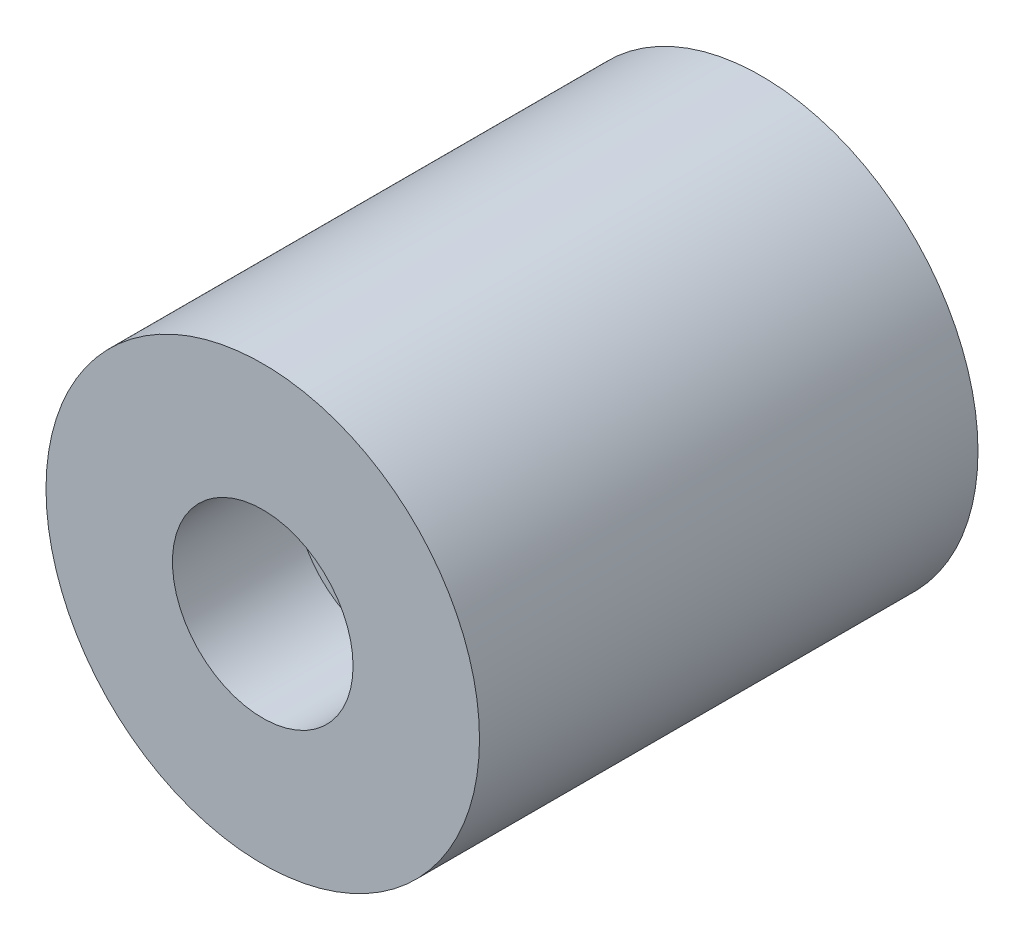
ISO-10303-21;
HEADER;
FILE_DESCRIPTION(('STEP AP214'),'2;1');
FILE_NAME('part.step','',(''),(''),'','','');
FILE_SCHEMA(('AUTOMOTIVE_DESIGN { 1 0 10303 214 1 1 1 1 }'));
ENDSEC;
DATA;
#1=APPLICATION_CONTEXT('core data for automotive mechanical design processes');
#2=APPLICATION_PROTOCOL_DEFINITION('international standard','automotive_design',2000,#1);
#3=PRODUCT_CONTEXT('',#1,'mechanical');
#4=PRODUCT('Part','Part','',(#3));
#5=PRODUCT_RELATED_PRODUCT_CATEGORY('part','',(#4));
#6=PRODUCT_DEFINITION_FORMATION('','',#4);
#7=PRODUCT_DEFINITION_CONTEXT('part definition',#1,'design');
#8=PRODUCT_DEFINITION('design','',#6,#7);
#9=PRODUCT_DEFINITION_SHAPE('','',#8);
#10=(LENGTH_UNIT() NAMED_UNIT(*) SI_UNIT(.MILLI.,.METRE.));
#11=(NAMED_UNIT(*) PLANE_ANGLE_UNIT() SI_UNIT($,.RADIAN.));
#12=(NAMED_UNIT(*) SI_UNIT($,.STERADIAN.) SOLID_ANGLE_UNIT());
#13=UNCERTAINTY_MEASURE_WITH_UNIT(LENGTH_MEASURE(1.E-05),#10,'distance_accuracy_value','');
#14=(GEOMETRIC_REPRESENTATION_CONTEXT(3) GLOBAL_UNCERTAINTY_ASSIGNED_CONTEXT((#13)) GLOBAL_UNIT_ASSIGNED_CONTEXT((#10,
#11,#12)) REPRESENTATION_CONTEXT('',''));
#15=CARTESIAN_POINT('',(0.,0.,0.));
#16=DIRECTION('',(0.,0.,1.));
#17=DIRECTION('',(1.,0.,0.));
#18=AXIS2_PLACEMENT_3D('',#15,#16,#17);
#19=CARTESIAN_POINT('',(0.,0.,-46.0859527144635));
#20=DIRECTION('',(0.,0.,1.));
#21=DIRECTION('',(1.,0.,0.));
#22=AXIS2_PLACEMENT_3D('',#19,#20,#21);
#23=CYLINDRICAL_SURFACE('',#22,3.25);
#24=CARTESIAN_POINT('',(0.,0.,-46.0859527144635));
#25=DIRECTION('',(0.,0.,1.));
#26=DIRECTION('',(1.,0.,0.));
#27=AXIS2_PLACEMENT_3D('',#24,#25,#26);
#28=CIRCLE('',#27,3.25);
#29=CARTESIAN_POINT('',(3.25,0.,-46.0859527144635));
#30=VERTEX_POINT('',#29);
#31=EDGE_CURVE('E50',#30,#30,#28,.T.);
#32=ORIENTED_EDGE('',*,*,#31,.F.);
#33=EDGE_LOOP('',(#32));
#34=FACE_BOUND('',#33,.T.);
#35=CARTESIAN_POINT('',(0.,0.,-36.09));
#36=DIRECTION('',(0.,0.,1.));
#37=DIRECTION('',(1.,0.,0.));
#38=AXIS2_PLACEMENT_3D('',#35,#36,#37);
#39=CIRCLE('',#38,3.25);
#40=CARTESIAN_POINT('',(3.25,0.,-36.09));
#41=VERTEX_POINT('',#40);
#42=EDGE_CURVE('E60',#41,#41,#39,.T.);
#43=ORIENTED_EDGE('',*,*,#42,.T.);
#44=EDGE_LOOP('',(#43));
#45=FACE_BOUND('',#44,.T.);
#46=ADVANCED_FACE('F31',(#34,#45),#23,.F.);
#47=CARTESIAN_POINT('',(0.,0.,-40.09));
#48=DIRECTION('',(0.,0.,1.));
#49=DIRECTION('',(1.,0.,0.));
#50=AXIS2_PLACEMENT_3D('',#47,#48,#49);
#51=CYLINDRICAL_SURFACE('',#50,30.);
#52=CARTESIAN_POINT('',(0.,0.,27.91));
#53=DIRECTION('',(0.,0.,1.));
#54=DIRECTION('',(1.,0.,0.));
#55=AXIS2_PLACEMENT_3D('',#52,#53,#54);
#56=CIRCLE('',#55,30.);
#57=CARTESIAN_POINT('',(30.,0.,27.91));
#58=VERTEX_POINT('',#57);
#59=EDGE_CURVE('E10',#58,#58,#56,.T.);
#60=ORIENTED_EDGE('',*,*,#59,.F.);
#61=EDGE_LOOP('',(#60));
#62=FACE_BOUND('',#61,.T.);
#63=CARTESIAN_POINT('',(0.,0.,-41.0859527144635));
#64=DIRECTION('',(0.,0.,-1.));
#65=DIRECTION('',(-1.,0.,0.));
#66=AXIS2_PLACEMENT_3D('',#63,#64,#65);
#67=CIRCLE('',#66,30.);
#68=CARTESIAN_POINT('',(-30.,0.,-41.0859527144635));
#69=VERTEX_POINT('',#68);
#70=EDGE_CURVE('E54',#69,#69,#67,.T.);
#71=ORIENTED_EDGE('',*,*,#70,.F.);
#72=EDGE_LOOP('',(#71));
#73=FACE_BOUND('',#72,.T.);
#74=ADVANCED_FACE('F33',(#62,#73),#51,.T.);
#75=CARTESIAN_POINT('',(0.,0.,-40.09));
#76=DIRECTION('',(0.,0.,1.));
#77=DIRECTION('',(1.,0.,0.));
#78=AXIS2_PLACEMENT_3D('',#75,#76,#77);
#79=CYLINDRICAL_SURFACE('',#78,9.25);
#80=CARTESIAN_POINT('',(0.,0.,-36.09));
#81=DIRECTION('',(0.,0.,1.));
#82=DIRECTION('',(1.,0.,0.));
#83=AXIS2_PLACEMENT_3D('',#80,#81,#82);
#84=CIRCLE('',#83,9.25);
#85=CARTESIAN_POINT('',(9.25,0.,-36.09));
#86=VERTEX_POINT('',#85);
#87=EDGE_CURVE('E57',#86,#86,#84,.T.);
#88=ORIENTED_EDGE('',*,*,#87,.F.);
#89=EDGE_LOOP('',(#88));
#90=FACE_BOUND('',#89,.T.);
#91=CARTESIAN_POINT('',(0.,0.,10.91));
#92=DIRECTION('',(0.,0.,1.));
#93=DIRECTION('',(1.,0.,0.));
#94=AXIS2_PLACEMENT_3D('',#91,#92,#93);
#95=CIRCLE('',#94,9.25);
#96=CARTESIAN_POINT('',(9.25,0.,10.91));
#97=VERTEX_POINT('',#96);
#98=EDGE_CURVE('E66',#97,#97,#95,.T.);
#99=ORIENTED_EDGE('',*,*,#98,.T.);
#100=EDGE_LOOP('',(#99));
#101=FACE_BOUND('',#100,.T.);
#102=ADVANCED_FACE('F70',(#90,#101),#79,.F.);
#103=CARTESIAN_POINT('',(0.,0.,27.91));
#104=DIRECTION('',(0.,0.,1.));
#105=DIRECTION('',(1.,0.,0.));
#106=AXIS2_PLACEMENT_3D('',#103,#104,#105);
#107=PLANE('',#106);
#108=CARTESIAN_POINT('',(0.,5.38517799615772E-13,27.91));
#109=DIRECTION('',(0.,0.,1.));
#110=DIRECTION('',(1.,0.,0.));
#111=AXIS2_PLACEMENT_3D('',#108,#109,#110);
#112=CIRCLE('',#111,12.5);
#113=CARTESIAN_POINT('',(12.5,5.38517799615772E-13,27.91));
#114=VERTEX_POINT('',#113);
#115=EDGE_CURVE('E38',#114,#114,#112,.T.);
#116=ORIENTED_EDGE('',*,*,#115,.F.);
#117=EDGE_LOOP('',(#116));
#118=FACE_BOUND('',#117,.T.);
#119=ORIENTED_EDGE('',*,*,#59,.T.);
#120=EDGE_LOOP('',(#119));
#121=FACE_BOUND('',#120,.T.);
#122=ADVANCED_FACE('F108',(#118,#121),#107,.T.);
#123=CARTESIAN_POINT('',(0.,5.38517799615772E-13,8.91));
#124=DIRECTION('',(0.,0.,1.));
#125=DIRECTION('',(1.,0.,0.));
#126=AXIS2_PLACEMENT_3D('',#123,#124,#125);
#127=CYLINDRICAL_SURFACE('',#126,12.5);
#128=CARTESIAN_POINT('',(0.,0.,10.91));
#129=DIRECTION('',(0.,0.,1.));
#130=DIRECTION('',(1.,0.,0.));
#131=AXIS2_PLACEMENT_3D('',#128,#129,#130);
#132=CIRCLE('',#131,12.5000000000002);
#133=CARTESIAN_POINT('',(12.5000000000002,0.,10.91));
#134=VERTEX_POINT('',#133);
#135=EDGE_CURVE('E63',#134,#134,#132,.T.);
#136=ORIENTED_EDGE('',*,*,#135,.F.);
#137=EDGE_LOOP('',(#136));
#138=FACE_BOUND('',#137,.T.);
#139=ORIENTED_EDGE('',*,*,#115,.T.);
#140=EDGE_LOOP('',(#139));
#141=FACE_BOUND('',#140,.T.);
#142=ADVANCED_FACE('F101',(#138,#141),#127,.F.);
#143=CARTESIAN_POINT('',(0.,0.,-41.0859527144635));
#144=DIRECTION('',(0.,0.,-1.));
#145=DIRECTION('',(-1.,0.,0.));
#146=AXIS2_PLACEMENT_3D('',#143,#144,#145);
#147=PLANE('',#146);
#148=CARTESIAN_POINT('',(0.,0.,-41.0859527144635));
#149=DIRECTION('',(0.,0.,-1.));
#150=DIRECTION('',(-1.,0.,0.));
#151=AXIS2_PLACEMENT_3D('',#148,#149,#150);
#152=CIRCLE('',#151,5.);
#153=CARTESIAN_POINT('',(-5.,0.,-41.0859527144635));
#154=VERTEX_POINT('',#153);
#155=EDGE_CURVE('E42',#154,#154,#152,.T.);
#156=ORIENTED_EDGE('',*,*,#155,.F.);
#157=EDGE_LOOP('',(#156));
#158=FACE_BOUND('',#157,.T.);
#159=ORIENTED_EDGE('',*,*,#70,.T.);
#160=EDGE_LOOP('',(#159));
#161=FACE_BOUND('',#160,.T.);
#162=ADVANCED_FACE('F97',(#158,#161),#147,.T.);
#163=CARTESIAN_POINT('',(0.,0.,-41.0859527144635));
#164=DIRECTION('',(0.,0.,-1.));
#165=DIRECTION('',(-1.,0.,0.));
#166=AXIS2_PLACEMENT_3D('',#163,#164,#165);
#167=CYLINDRICAL_SURFACE('',#166,5.);
#168=ORIENTED_EDGE('',*,*,#155,.T.);
#169=EDGE_LOOP('',(#168));
#170=FACE_BOUND('',#169,.T.);
#171=CARTESIAN_POINT('',(0.,0.,-46.0859527144635));
#172=DIRECTION('',(0.,0.,-1.));
#173=DIRECTION('',(-1.,0.,0.));
#174=AXIS2_PLACEMENT_3D('',#171,#172,#173);
#175=CIRCLE('',#174,5.);
#176=CARTESIAN_POINT('',(-5.,0.,-46.0859527144635));
#177=VERTEX_POINT('',#176);
#178=EDGE_CURVE('E46',#177,#177,#175,.T.);
#179=ORIENTED_EDGE('',*,*,#178,.F.);
#180=EDGE_LOOP('',(#179));
#181=FACE_BOUND('',#180,.T.);
#182=ADVANCED_FACE('F94',(#170,#181),#167,.T.);
#183=CARTESIAN_POINT('',(0.,-3.26240768688519E-13,-46.0859527144635));
#184=DIRECTION('',(0.,0.,1.));
#185=DIRECTION('',(1.,0.,0.));
#186=AXIS2_PLACEMENT_3D('',#183,#184,#185);
#187=PLANE('',#186);
#188=ORIENTED_EDGE('',*,*,#31,.T.);
#189=EDGE_LOOP('',(#188));
#190=FACE_BOUND('',#189,.T.);
#191=ORIENTED_EDGE('',*,*,#178,.T.);
#192=EDGE_LOOP('',(#191));
#193=FACE_BOUND('',#192,.T.);
#194=ADVANCED_FACE('F80',(#190,#193),#187,.F.);
#195=CARTESIAN_POINT('',(0.,0.,-36.09));
#196=DIRECTION('',(0.,0.,1.));
#197=DIRECTION('',(1.,0.,0.));
#198=AXIS2_PLACEMENT_3D('',#195,#196,#197);
#199=PLANE('',#198);
#200=ORIENTED_EDGE('',*,*,#42,.F.);
#201=EDGE_LOOP('',(#200));
#202=FACE_BOUND('',#201,.T.);
#203=ORIENTED_EDGE('',*,*,#87,.T.);
#204=EDGE_LOOP('',(#203));
#205=FACE_BOUND('',#204,.T.);
#206=ADVANCED_FACE('F74',(#202,#205),#199,.T.);
#207=CARTESIAN_POINT('',(0.,0.,10.91));
#208=DIRECTION('',(0.,0.,1.));
#209=DIRECTION('',(1.,0.,0.));
#210=AXIS2_PLACEMENT_3D('',#207,#208,#209);
#211=PLANE('',#210);
#212=ORIENTED_EDGE('',*,*,#135,.T.);
#213=EDGE_LOOP('',(#212));
#214=FACE_BOUND('',#213,.T.);
#215=ORIENTED_EDGE('',*,*,#98,.F.);
#216=EDGE_LOOP('',(#215));
#217=FACE_BOUND('',#216,.T.);
#218=ADVANCED_FACE('F72',(#214,#217),#211,.T.);
#219=CLOSED_SHELL('',(#46,#74,#102,#122,#142,#162,#182,#194,#206,#218));
#220=MANIFOLD_SOLID_BREP('B2',#219);
#221=ADVANCED_BREP_SHAPE_REPRESENTATION('',(#18,#220),#14);
#222=SHAPE_DEFINITION_REPRESENTATION(#9,#221);
ENDSEC;
END-ISO-10303-21;
